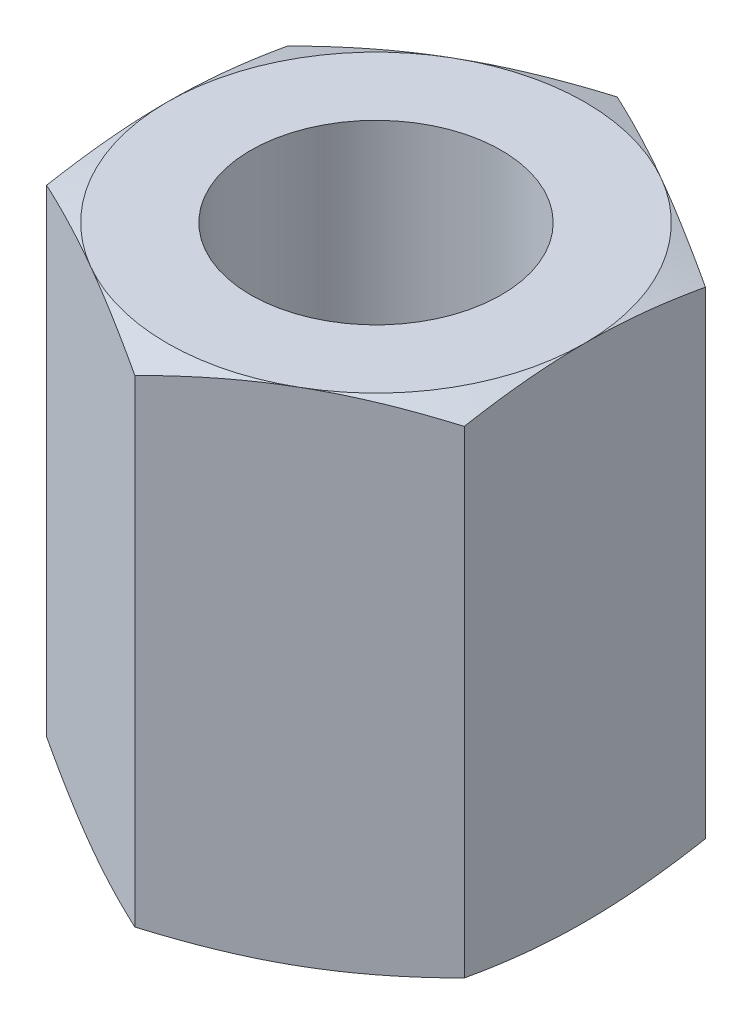
ISO-10303-21;
HEADER;
FILE_DESCRIPTION(('STEP AP214'),'2;1');
FILE_NAME('part.step','',(''),(''),'','','');
FILE_SCHEMA(('AUTOMOTIVE_DESIGN { 1 0 10303 214 1 1 1 1 }'));
ENDSEC;
DATA;
#1=APPLICATION_CONTEXT('core data for automotive mechanical design processes');
#2=APPLICATION_PROTOCOL_DEFINITION('international standard','automotive_design',2000,#1);
#3=PRODUCT_CONTEXT('',#1,'mechanical');
#4=PRODUCT('Part','Part','',(#3));
#5=PRODUCT_RELATED_PRODUCT_CATEGORY('part','',(#4));
#6=PRODUCT_DEFINITION_FORMATION('','',#4);
#7=PRODUCT_DEFINITION_CONTEXT('part definition',#1,'design');
#8=PRODUCT_DEFINITION('design','',#6,#7);
#9=PRODUCT_DEFINITION_SHAPE('','',#8);
#10=(LENGTH_UNIT() NAMED_UNIT(*) SI_UNIT(.MILLI.,.METRE.));
#11=(NAMED_UNIT(*) PLANE_ANGLE_UNIT() SI_UNIT($,.RADIAN.));
#12=(NAMED_UNIT(*) SI_UNIT($,.STERADIAN.) SOLID_ANGLE_UNIT());
#13=UNCERTAINTY_MEASURE_WITH_UNIT(LENGTH_MEASURE(1.E-05),#10,'distance_accuracy_value','');
#14=(GEOMETRIC_REPRESENTATION_CONTEXT(3) GLOBAL_UNCERTAINTY_ASSIGNED_CONTEXT((#13)) GLOBAL_UNIT_ASSIGNED_CONTEXT((#10,
#11,#12)) REPRESENTATION_CONTEXT('',''));
#15=CARTESIAN_POINT('',(0.,0.,0.));
#16=DIRECTION('',(0.,0.,1.));
#17=DIRECTION('',(1.,0.,0.));
#18=AXIS2_PLACEMENT_3D('',#15,#16,#17);
#19=CARTESIAN_POINT('',(0.,6.,0.));
#20=DIRECTION('',(0.,1.,0.));
#21=DIRECTION('',(0.,0.,1.));
#22=AXIS2_PLACEMENT_3D('',#19,#20,#21);
#23=PLANE('',#22);
#24=CARTESIAN_POINT('',(0.,6.,0.));
#25=DIRECTION('',(0.,-1.,0.));
#26=DIRECTION('',(0.,0.,-1.));
#27=AXIS2_PLACEMENT_3D('',#24,#25,#26);
#28=CIRCLE('',#27,2.5);
#29=CARTESIAN_POINT('',(-1.24999999999999,6.,2.1650635094611));
#30=VERTEX_POINT('',#29);
#31=CARTESIAN_POINT('',(-2.5,6.,0.));
#32=VERTEX_POINT('',#31);
#33=EDGE_CURVE('E340',#30,#32,#28,.T.);
#34=ORIENTED_EDGE('',*,*,#33,.F.);
#35=CARTESIAN_POINT('',(1.25000000000002,6.,2.16506350946109));
#36=VERTEX_POINT('',#35);
#37=EDGE_CURVE('E338',#36,#30,#28,.T.);
#38=ORIENTED_EDGE('',*,*,#37,.F.);
#39=CARTESIAN_POINT('',(2.5,6.,0.));
#40=VERTEX_POINT('',#39);
#41=EDGE_CURVE('E336',#40,#36,#28,.T.);
#42=ORIENTED_EDGE('',*,*,#41,.F.);
#43=CARTESIAN_POINT('',(1.24999999999999,6.,-2.16506350946111));
#44=VERTEX_POINT('',#43);
#45=EDGE_CURVE('E243',#44,#40,#28,.T.);
#46=ORIENTED_EDGE('',*,*,#45,.F.);
#47=CARTESIAN_POINT('',(-1.25,6.,-2.1650635094611));
#48=VERTEX_POINT('',#47);
#49=EDGE_CURVE('E339',#48,#44,#28,.T.);
#50=ORIENTED_EDGE('',*,*,#49,.F.);
#51=EDGE_CURVE('E344',#32,#48,#28,.T.);
#52=ORIENTED_EDGE('',*,*,#51,.F.);
#53=EDGE_LOOP('',(#34,#38,#42,#46,#50,#52));
#54=FACE_BOUND('',#53,.T.);
#55=CARTESIAN_POINT('',(0.,6.,0.));
#56=DIRECTION('',(0.,1.,0.));
#57=DIRECTION('',(0.,0.,1.));
#58=AXIS2_PLACEMENT_3D('',#55,#56,#57);
#59=CIRCLE('',#58,1.5);
#60=CARTESIAN_POINT('',(0.,6.,1.5));
#61=VERTEX_POINT('',#60);
#62=EDGE_CURVE('E306',#61,#61,#59,.T.);
#63=ORIENTED_EDGE('',*,*,#62,.F.);
#64=EDGE_LOOP('',(#63));
#65=FACE_BOUND('',#64,.T.);
#66=ADVANCED_FACE('F33',(#54,#65),#23,.T.);
#67=CARTESIAN_POINT('',(0.,0.,0.));
#68=DIRECTION('',(0.,1.,0.));
#69=DIRECTION('',(0.,0.,1.));
#70=AXIS2_PLACEMENT_3D('',#67,#68,#69);
#71=PLANE('',#70);
#72=CARTESIAN_POINT('',(0.,0.,0.));
#73=DIRECTION('',(0.,-1.,0.));
#74=DIRECTION('',(0.,0.,-1.));
#75=AXIS2_PLACEMENT_3D('',#72,#73,#74);
#76=CIRCLE('',#75,2.5);
#77=CARTESIAN_POINT('',(1.25000000000002,0.,2.16506350946109));
#78=VERTEX_POINT('',#77);
#79=CARTESIAN_POINT('',(-1.24999999999999,0.,2.1650635094611));
#80=VERTEX_POINT('',#79);
#81=EDGE_CURVE('E138',#78,#80,#76,.T.);
#82=ORIENTED_EDGE('',*,*,#81,.T.);
#83=CARTESIAN_POINT('',(-2.5,0.,0.));
#84=VERTEX_POINT('',#83);
#85=EDGE_CURVE('E161',#80,#84,#76,.T.);
#86=ORIENTED_EDGE('',*,*,#85,.T.);
#87=CARTESIAN_POINT('',(-1.25,0.,-2.1650635094611));
#88=VERTEX_POINT('',#87);
#89=EDGE_CURVE('E160',#84,#88,#76,.T.);
#90=ORIENTED_EDGE('',*,*,#89,.T.);
#91=CARTESIAN_POINT('',(1.24999999999999,0.,-2.16506350946111));
#92=VERTEX_POINT('',#91);
#93=EDGE_CURVE('E157',#88,#92,#76,.T.);
#94=ORIENTED_EDGE('',*,*,#93,.T.);
#95=CARTESIAN_POINT('',(2.5,0.,0.));
#96=VERTEX_POINT('',#95);
#97=EDGE_CURVE('E55',#92,#96,#76,.T.);
#98=ORIENTED_EDGE('',*,*,#97,.T.);
#99=EDGE_CURVE('E131',#96,#78,#76,.T.);
#100=ORIENTED_EDGE('',*,*,#99,.T.);
#101=EDGE_LOOP('',(#82,#86,#90,#94,#98,#100));
#102=FACE_BOUND('',#101,.T.);
#103=CARTESIAN_POINT('',(0.,0.,0.));
#104=DIRECTION('',(0.,1.,0.));
#105=DIRECTION('',(0.,0.,1.));
#106=AXIS2_PLACEMENT_3D('',#103,#104,#105);
#107=CIRCLE('',#106,1.5);
#108=CARTESIAN_POINT('',(0.,0.,1.5));
#109=VERTEX_POINT('',#108);
#110=EDGE_CURVE('E309',#109,#109,#107,.T.);
#111=ORIENTED_EDGE('',*,*,#110,.T.);
#112=EDGE_LOOP('',(#111));
#113=FACE_BOUND('',#112,.T.);
#114=ADVANCED_FACE('F154',(#102,#113),#71,.F.);
#115=CARTESIAN_POINT('',(2.49999999999998,6.,-1.44337567297409));
#116=DIRECTION('',(-0.499999999999995,0.,0.866025403784441));
#117=DIRECTION('',(0.866025403784442,0.,0.499999999999995));
#118=AXIS2_PLACEMENT_3D('',#115,#116,#117);
#119=PLANE('',#118);
#120=DIRECTION('',(0.,-1.,0.));
#121=VECTOR('',#120,1.);
#122=CARTESIAN_POINT('',(2.49999999999998,6.,-1.44337567297409));
#123=LINE('',#122,#121);
#124=CARTESIAN_POINT('',(2.49999999999999,5.85923402201249,-1.44337567297409));
#125=VERTEX_POINT('',#124);
#126=CARTESIAN_POINT('',(2.49999999999998,0.140765977987506,-1.44337567297409));
#127=VERTEX_POINT('',#126);
#128=EDGE_CURVE('E312',#125,#127,#123,.T.);
#129=ORIENTED_EDGE('',*,*,#128,.T.);
#130=CARTESIAN_POINT('',(2.50019999999998,0.140808008171611,-1.44326020292026));
#131=CARTESIAN_POINT('',(2.39665305132346,0.119039069131315,-1.50304306161241));
#132=CARTESIAN_POINT('',(2.29276461388714,0.0992363286997188,-1.56302307893196));
#133=CARTESIAN_POINT('',(2.08431213823203,0.0643963200817523,-1.68337317186468));
#134=CARTESIAN_POINT('',(1.97974763612162,0.0493627822141135,-1.7437435153058));
#135=CARTESIAN_POINT('',(1.77110364851345,0.025046411161083,-1.86420417771618));
#136=CARTESIAN_POINT('',(1.6670289296066,0.0157105319226291,-1.92429174469288));
#137=CARTESIAN_POINT('',(1.45863606978594,0.00318847973073293,-2.04460741840753));
#138=CARTESIAN_POINT('',(1.35431803489297,0.,-2.10483546393432));
#139=CARTESIAN_POINT('',(1.14568196510702,0.,-2.2252915549879));
#140=CARTESIAN_POINT('',(1.04136393021405,0.00318847973073272,-2.28551960051469));
#141=CARTESIAN_POINT('',(0.832971070393385,0.015710531922629,-2.40583527422935));
#142=CARTESIAN_POINT('',(0.728896351486536,0.025046411161083,-2.46592284120605));
#143=CARTESIAN_POINT('',(0.520252363878367,0.0493627822141135,-2.58638350361642));
#144=CARTESIAN_POINT('',(0.415687861767961,0.0643963200817522,-2.64675384705754));
#145=CARTESIAN_POINT('',(0.207235386112848,0.0992363286997185,-2.76710393999026));
#146=CARTESIAN_POINT('',(0.103346948676527,0.119039069131315,-2.82708395730981));
#147=CARTESIAN_POINT('',(-0.0001999999999993,0.140808008171611,-2.88686681600197));
#148=B_SPLINE_CURVE_WITH_KNOTS('',3,(#130,#131,#132,#133,#134,#135,#136,#137,#138,#139,#140,
#141,#142,#143,#144,#145,#146,#147),.UNSPECIFIED.,.F.,.F.,(4,2,2,2,2,2,2,2,4),(0.,
0.364631406980055,0.729547317866326,1.09101180768958,1.45234063356534,1.8136694594411,
2.17513394926436,2.54004986015063,2.90468126713068),.UNSPECIFIED.);
#149=EDGE_CURVE('E143',#127,#92,#148,.T.);
#150=ORIENTED_EDGE('',*,*,#149,.T.);
#151=CARTESIAN_POINT('',(0.,0.140765977987506,-2.88675134594813));
#152=VERTEX_POINT('',#151);
#153=EDGE_CURVE('E351',#92,#152,#148,.T.);
#154=ORIENTED_EDGE('',*,*,#153,.T.);
#155=DIRECTION('',(0.,-1.,0.));
#156=VECTOR('',#155,1.);
#157=CARTESIAN_POINT('',(0.,6.,-2.88675134594813));
#158=LINE('',#157,#156);
#159=CARTESIAN_POINT('',(0.,5.85923402201249,-2.88675134594813));
#160=VERTEX_POINT('',#159);
#161=EDGE_CURVE('E322',#160,#152,#158,.T.);
#162=ORIENTED_EDGE('',*,*,#161,.F.);
#163=CARTESIAN_POINT('',(-0.000199999999999947,5.85919199182839,-2.88686681600197));
#164=CARTESIAN_POINT('',(0.103346948676526,5.88096093086869,-2.82708395730981));
#165=CARTESIAN_POINT('',(0.207235386112847,5.90076367130028,-2.76710393999026));
#166=CARTESIAN_POINT('',(0.41568786176796,5.93560367991825,-2.64675384705754));
#167=CARTESIAN_POINT('',(0.520252363878367,5.95063721778589,-2.58638350361642));
#168=CARTESIAN_POINT('',(0.728896351486535,5.97495358883892,-2.46592284120605));
#169=CARTESIAN_POINT('',(0.832971070393384,5.98428946807737,-2.40583527422935));
#170=CARTESIAN_POINT('',(1.04136393021405,5.99681152026927,-2.28551960051469));
#171=CARTESIAN_POINT('',(1.14568196510702,6.,-2.2252915549879));
#172=CARTESIAN_POINT('',(1.35431803489297,6.,-2.10483546393432));
#173=CARTESIAN_POINT('',(1.45863606978594,5.99681152026927,-2.04460741840753));
#174=CARTESIAN_POINT('',(1.6670289296066,5.98428946807737,-1.92429174469288));
#175=CARTESIAN_POINT('',(1.77110364851345,5.97495358883892,-1.86420417771618));
#176=CARTESIAN_POINT('',(1.97974763612162,5.95063721778589,-1.7437435153058));
#177=CARTESIAN_POINT('',(2.08431213823203,5.93560367991825,-1.68337317186468));
#178=CARTESIAN_POINT('',(2.29276461388714,5.90076367130028,-1.56302307893196));
#179=CARTESIAN_POINT('',(2.39665305132346,5.88096093086869,-1.50304306161241));
#180=CARTESIAN_POINT('',(2.50019999999998,5.85919199182839,-1.44326020292026));
#181=B_SPLINE_CURVE_WITH_KNOTS('',3,(#163,#164,#165,#166,#167,#168,#169,#170,#171,#172,#173,
#174,#175,#176,#177,#178,#179,#180),.UNSPECIFIED.,.F.,.F.,(4,2,2,2,2,2,2,2,4),(0.,
0.364631406980055,0.729547317866326,1.09101180768958,1.45234063356534,1.8136694594411,
2.17513394926436,2.54004986015063,2.90468126713068),.UNSPECIFIED.);
#182=EDGE_CURVE('E251',#160,#44,#181,.T.);
#183=ORIENTED_EDGE('',*,*,#182,.T.);
#184=EDGE_CURVE('E242',#44,#125,#181,.T.);
#185=ORIENTED_EDGE('',*,*,#184,.T.);
#186=EDGE_LOOP('',(#129,#150,#154,#162,#183,#185));
#187=FACE_BOUND('',#186,.T.);
#188=ADVANCED_FACE('F35',(#187),#119,.F.);
#189=CARTESIAN_POINT('',(0.,6.,-2.88675134594813));
#190=DIRECTION('',(0.500000000000001,0.,0.866025403784438));
#191=DIRECTION('',(0.866025403784438,0.,-0.500000000000001));
#192=AXIS2_PLACEMENT_3D('',#189,#190,#191);
#193=PLANE('',#192);
#194=ORIENTED_EDGE('',*,*,#161,.T.);
#195=CARTESIAN_POINT('',(0.000200000000000051,0.140808008171612,-2.88686681600197));
#196=CARTESIAN_POINT('',(-0.103346948676527,0.119039069131315,-2.82708395730981));
#197=CARTESIAN_POINT('',(-0.207235386112849,0.0992363286997179,-2.76710393999026));
#198=CARTESIAN_POINT('',(-0.415687861767963,0.0643963200817505,-2.64675384705754));
#199=CARTESIAN_POINT('',(-0.520252363878371,0.0493627822141112,-2.58638350361641));
#200=CARTESIAN_POINT('',(-0.728896351486541,0.02504641116108,-2.46592284120604));
#201=CARTESIAN_POINT('',(-0.832971070393391,0.0157105319226258,-2.40583527422933));
#202=CARTESIAN_POINT('',(-1.04136393021405,0.00318847973072924,-2.28551960051468));
#203=CARTESIAN_POINT('',(-1.14568196510703,0.,-2.22529155498789));
#204=CARTESIAN_POINT('',(-1.35431803489298,0.,-2.1048354639343));
#205=CARTESIAN_POINT('',(-1.45863606978595,0.00318847973072923,-2.04460741840751));
#206=CARTESIAN_POINT('',(-1.66702892960661,0.0157105319226257,-1.92429174469286));
#207=CARTESIAN_POINT('',(-1.77110364851346,0.0250464111610799,-1.86420417771615));
#208=CARTESIAN_POINT('',(-1.97974763612163,0.049362782214111,-1.74374351530578));
#209=CARTESIAN_POINT('',(-2.08431213823204,0.0643963200817502,-1.68337317186465));
#210=CARTESIAN_POINT('',(-2.29276461388716,0.0992363286997176,-1.56302307893193));
#211=CARTESIAN_POINT('',(-2.39665305132348,0.119039069131314,-1.50304306161238));
#212=CARTESIAN_POINT('',(-2.5002,0.140808008171611,-1.44326020292022));
#213=B_SPLINE_CURVE_WITH_KNOTS('',3,(#195,#196,#197,#198,#199,#200,#201,#202,#203,#204,#205,
#206,#207,#208,#209,#210,#211,#212),.UNSPECIFIED.,.F.,.F.,(4,2,2,2,2,2,2,2,4),(0.,
0.364631406980059,0.729547317866335,1.0910118076896,1.45234063356536,1.81366945944112,
2.17513394926438,2.54004986015066,2.90468126713072),.UNSPECIFIED.);
#214=EDGE_CURVE('E189',#152,#88,#213,.T.);
#215=ORIENTED_EDGE('',*,*,#214,.T.);
#216=CARTESIAN_POINT('',(-2.5,0.140765977987506,-1.44337567297406));
#217=VERTEX_POINT('',#216);
#218=EDGE_CURVE('E188',#88,#217,#213,.T.);
#219=ORIENTED_EDGE('',*,*,#218,.T.);
#220=DIRECTION('',(0.,-1.,0.));
#221=VECTOR('',#220,1.);
#222=CARTESIAN_POINT('',(-2.5,6.,-1.44337567297406));
#223=LINE('',#222,#221);
#224=CARTESIAN_POINT('',(-2.5,5.85923402201249,-1.44337567297406));
#225=VERTEX_POINT('',#224);
#226=EDGE_CURVE('E184',#225,#217,#223,.T.);
#227=ORIENTED_EDGE('',*,*,#226,.F.);
#228=CARTESIAN_POINT('',(-2.5002,5.85919199182839,-1.44326020292022));
#229=CARTESIAN_POINT('',(-2.39665305132348,5.88096093086869,-1.50304306161238));
#230=CARTESIAN_POINT('',(-2.29276461388716,5.90076367130028,-1.56302307893193));
#231=CARTESIAN_POINT('',(-2.08431213823204,5.93560367991825,-1.68337317186465));
#232=CARTESIAN_POINT('',(-1.97974763612163,5.95063721778589,-1.74374351530578));
#233=CARTESIAN_POINT('',(-1.77110364851346,5.97495358883892,-1.86420417771615));
#234=CARTESIAN_POINT('',(-1.66702892960661,5.98428946807737,-1.92429174469286));
#235=CARTESIAN_POINT('',(-1.45863606978595,5.99681152026927,-2.04460741840751));
#236=CARTESIAN_POINT('',(-1.35431803489298,6.,-2.1048354639343));
#237=CARTESIAN_POINT('',(-1.14568196510703,6.,-2.22529155498789));
#238=CARTESIAN_POINT('',(-1.04136393021405,5.99681152026927,-2.28551960051468));
#239=CARTESIAN_POINT('',(-0.832971070393391,5.98428946807737,-2.40583527422933));
#240=CARTESIAN_POINT('',(-0.728896351486541,5.97495358883892,-2.46592284120604));
#241=CARTESIAN_POINT('',(-0.520252363878371,5.95063721778589,-2.58638350361641));
#242=CARTESIAN_POINT('',(-0.415687861767963,5.93560367991825,-2.64675384705754));
#243=CARTESIAN_POINT('',(-0.207235386112849,5.90076367130028,-2.76710393999026));
#244=CARTESIAN_POINT('',(-0.103346948676527,5.88096093086869,-2.82708395730981));
#245=CARTESIAN_POINT('',(0.000199999999999951,5.85919199182839,-2.88686681600197));
#246=B_SPLINE_CURVE_WITH_KNOTS('',3,(#228,#229,#230,#231,#232,#233,#234,#235,#236,#237,#238,
#239,#240,#241,#242,#243,#244,#245),.UNSPECIFIED.,.F.,.F.,(4,2,2,2,2,2,2,2,4),(0.,
0.364631406980059,0.729547317866335,1.0910118076896,1.45234063356536,1.81366945944112,
2.17513394926439,2.54004986015066,2.90468126713072),.UNSPECIFIED.);
#247=EDGE_CURVE('E267',#225,#48,#246,.T.);
#248=ORIENTED_EDGE('',*,*,#247,.T.);
#249=EDGE_CURVE('E259',#48,#160,#246,.T.);
#250=ORIENTED_EDGE('',*,*,#249,.T.);
#251=EDGE_LOOP('',(#194,#215,#219,#227,#248,#250));
#252=FACE_BOUND('',#251,.T.);
#253=ADVANCED_FACE('F274',(#252),#193,.F.);
#254=CARTESIAN_POINT('',(-2.5,6.,-1.44337567297406));
#255=DIRECTION('',(1.,0.,0.));
#256=DIRECTION('',(0.,0.,-1.));
#257=AXIS2_PLACEMENT_3D('',#254,#255,#256);
#258=PLANE('',#257);
#259=ORIENTED_EDGE('',*,*,#226,.T.);
#260=CARTESIAN_POINT('',(-2.50000000000001,0.911069918498288,-4.33375705030873));
#261=CARTESIAN_POINT('',(-2.50000000000001,0.857151962741812,-4.1626121487893));
#262=CARTESIAN_POINT('',(-2.50000000000001,0.803889247670842,-3.99125292656233));
#263=CARTESIAN_POINT('',(-2.50000000000001,0.699303356408631,-3.6479012296047));
#264=CARTESIAN_POINT('',(-2.50000000000001,0.647980635713844,-3.47590861643411));
#265=CARTESIAN_POINT('',(-2.50000000000001,0.547192255797197,-3.12862476065281));
#266=CARTESIAN_POINT('',(-2.50000000000001,0.497765115102514,-2.95332226186823));
#267=CARTESIAN_POINT('',(-2.50000000000001,0.402640277745618,-2.60170577064684));
#268=CARTESIAN_POINT('',(-2.50000000000001,0.356942439150244,-2.42539181697851));
#269=CARTESIAN_POINT('',(-2.50000000000001,0.272638394402238,-2.079015966178));
#270=CARTESIAN_POINT('',(-2.50000000000001,0.23381285721517,-1.90900813322596));
#271=CARTESIAN_POINT('',(-2.50000000000001,0.162867038370284,-1.56755699875981));
#272=CARTESIAN_POINT('',(-2.5,0.130747206656142,-1.39611360172359));
#273=CARTESIAN_POINT('',(-2.5,0.0758518227791671,-1.05306244520634));
#274=CARTESIAN_POINT('',(-2.5,0.0530056159219204,-0.881466309778314));
#275=CARTESIAN_POINT('',(-2.5,0.0188225697475267,-0.537127667934878));
#276=CARTESIAN_POINT('',(-2.5,0.00748169084072173,-0.364385585324893));
#277=CARTESIAN_POINT('',(-2.5,4.41044611643525E-05,-0.097393884714278));
#278=CARTESIAN_POINT('',(-2.5,-0.000644888189889834,-0.00325681931257186));
#279=CARTESIAN_POINT('',(-2.5,0.00184631107398365,0.184970103743175));
#280=CARTESIAN_POINT('',(-2.5,0.00502655264592363,0.279059960775849));
#281=CARTESIAN_POINT('',(-2.5,0.0151239518844881,0.467060430735583));
#282=CARTESIAN_POINT('',(-2.5,0.0220420903773777,0.560970990121263));
#283=CARTESIAN_POINT('',(-2.5,0.0393313521905035,0.748477331015612));
#284=CARTESIAN_POINT('',(-2.5,0.0497028075871423,0.842073081377101));
#285=CARTESIAN_POINT('',(-2.5,0.0856400575240508,1.12380926395695));
#286=CARTESIAN_POINT('',(-2.5,0.115934676805286,1.31134961033419));
#287=CARTESIAN_POINT('',(-2.49999999999999,0.185757521056653,1.68464568549849));
#288=CARTESIAN_POINT('',(-2.49999999999999,0.225286525445448,1.87040126226529));
#289=CARTESIAN_POINT('',(-2.49999999999999,0.312868160934003,2.2492938430945));
#290=CARTESIAN_POINT('',(-2.49999999999999,0.361239314019709,2.44235614952978));
#291=CARTESIAN_POINT('',(-2.49999999999999,0.462845732200084,2.82717406569172));
#292=CARTESIAN_POINT('',(-2.49999999999999,0.516080908992447,3.01892969907207));
#293=CARTESIAN_POINT('',(-2.49999999999999,0.625017863722866,3.39827826743581));
#294=CARTESIAN_POINT('',(-2.49999999999999,0.680663797121242,3.58588734311866));
#295=CARTESIAN_POINT('',(-2.49999999999999,0.765880720880502,3.86673968266629));
#296=CARTESIAN_POINT('',(-2.49999999999999,0.794573796432836,3.96025127643636));
#297=CARTESIAN_POINT('',(-2.49999999999999,0.852463883475552,4.14711653548762));
#298=CARTESIAN_POINT('',(-2.49999999999999,0.881660885655843,4.24047020365159));
#299=CARTESIAN_POINT('',(-2.49999999999999,0.911069918498289,4.33375705030875));
#300=B_SPLINE_CURVE_WITH_KNOTS('',3,(#260,#261,#262,#263,#264,#265,#266,#267,#268,#269,#270,
#271,#272,#273,#274,#275,#276,#277,#278,#279,#280,#281,#282,#283,#284,#285,#286,#287,#288,#289,
#290,#291,#292,#293,#294,#295,#296,#297,#298,#299),.UNSPECIFIED.,.F.,.F.,(4,2,2,2,2,2,2,2,2,2,2,
2,2,2,2,2,2,2,2,4),(0.,0.538321778022808,1.0767691747435,1.6231524355488,2.16951489189722,
2.69257527905729,3.21567075158284,3.73470243407139,4.25355181828763,4.53589900114565,
4.81824980763166,5.10067473913603,5.38312683691474,5.95267633652756,6.52227392575275,
7.11926798158167,7.71625120163244,8.3032921668782,8.59673518713048,8.89017279178626),.UNSPECIFIED.);
#301=EDGE_CURVE('E178',#217,#84,#300,.T.);
#302=ORIENTED_EDGE('',*,*,#301,.T.);
#303=CARTESIAN_POINT('',(-2.49999999999999,0.140765977987506,1.44337567297408));
#304=VERTEX_POINT('',#303);
#305=EDGE_CURVE('E174',#84,#304,#300,.T.);
#306=ORIENTED_EDGE('',*,*,#305,.T.);
#307=DIRECTION('',(0.,-1.,0.));
#308=VECTOR('',#307,1.);
#309=CARTESIAN_POINT('',(-2.5,6.,1.44337567297408));
#310=LINE('',#309,#308);
#311=CARTESIAN_POINT('',(-2.49999999999999,5.85923402201249,1.44337567297408));
#312=VERTEX_POINT('',#311);
#313=EDGE_CURVE('E319',#312,#304,#310,.T.);
#314=ORIENTED_EDGE('',*,*,#313,.F.);
#315=CARTESIAN_POINT('',(-2.49999999999999,5.08893008150171,4.33375705030875));
#316=CARTESIAN_POINT('',(-2.49999999999999,5.14284803725819,4.16261214878932));
#317=CARTESIAN_POINT('',(-2.49999999999999,5.19611075232916,3.99125292656235));
#318=CARTESIAN_POINT('',(-2.49999999999999,5.30069664359137,3.64790122960472));
#319=CARTESIAN_POINT('',(-2.49999999999999,5.35201936428616,3.47590861643412));
#320=CARTESIAN_POINT('',(-2.49999999999999,5.4528077442028,3.12862476065282));
#321=CARTESIAN_POINT('',(-2.49999999999999,5.50223488489749,2.95332226186824));
#322=CARTESIAN_POINT('',(-2.49999999999999,5.59735972225438,2.60170577064686));
#323=CARTESIAN_POINT('',(-2.49999999999999,5.64305756084976,2.42539181697853));
#324=CARTESIAN_POINT('',(-2.49999999999999,5.72736160559776,2.07901596617802));
#325=CARTESIAN_POINT('',(-2.49999999999999,5.76618714278483,1.90900813322597));
#326=CARTESIAN_POINT('',(-2.49999999999999,5.83713296162972,1.56755699875983));
#327=CARTESIAN_POINT('',(-2.5,5.86925279334386,1.39611360172361));
#328=CARTESIAN_POINT('',(-2.5,5.92414817722083,1.05306244520636));
#329=CARTESIAN_POINT('',(-2.5,5.94699438407808,0.88146630977833));
#330=CARTESIAN_POINT('',(-2.5,5.98117743025247,0.537127667934894));
#331=CARTESIAN_POINT('',(-2.5,5.99251830915928,0.364385585324909));
#332=CARTESIAN_POINT('',(-2.5,5.99995589553884,0.0973938847142936));
#333=CARTESIAN_POINT('',(-2.5,6.00064488818989,0.00325681931258734));
#334=CARTESIAN_POINT('',(-2.5,5.99815368892602,-0.18497010374316));
#335=CARTESIAN_POINT('',(-2.5,5.99497344735408,-0.279059960775834));
#336=CARTESIAN_POINT('',(-2.5,5.98487604811551,-0.467060430735568));
#337=CARTESIAN_POINT('',(-2.5,5.97795790962262,-0.560970990121248));
#338=CARTESIAN_POINT('',(-2.5,5.9606686478095,-0.748477331015597));
#339=CARTESIAN_POINT('',(-2.5,5.95029719241286,-0.842073081377085));
#340=CARTESIAN_POINT('',(-2.5,5.91435994247595,-1.12380926395693));
#341=CARTESIAN_POINT('',(-2.5,5.88406532319471,-1.31134961033417));
#342=CARTESIAN_POINT('',(-2.50000000000001,5.81424247894335,-1.68464568549847));
#343=CARTESIAN_POINT('',(-2.50000000000001,5.77471347455455,-1.87040126226527));
#344=CARTESIAN_POINT('',(-2.50000000000001,5.687131839066,-2.24929384309449));
#345=CARTESIAN_POINT('',(-2.50000000000001,5.63876068598029,-2.44235614952976));
#346=CARTESIAN_POINT('',(-2.50000000000001,5.53715426779992,-2.8271740656917));
#347=CARTESIAN_POINT('',(-2.50000000000001,5.48391909100755,-3.01892969907205));
#348=CARTESIAN_POINT('',(-2.50000000000001,5.37498213627713,-3.39827826743579));
#349=CARTESIAN_POINT('',(-2.50000000000001,5.31933620287876,-3.58588734311864));
#350=CARTESIAN_POINT('',(-2.50000000000001,5.2341192791195,-3.86673968266627));
#351=CARTESIAN_POINT('',(-2.50000000000001,5.20542620356716,-3.96025127643634));
#352=CARTESIAN_POINT('',(-2.50000000000001,5.14753611652445,-4.14711653548761));
#353=CARTESIAN_POINT('',(-2.50000000000001,5.11833911434416,-4.24047020365157));
#354=CARTESIAN_POINT('',(-2.50000000000001,5.08893008150171,-4.33375705030873));
#355=B_SPLINE_CURVE_WITH_KNOTS('',3,(#315,#316,#317,#318,#319,#320,#321,#322,#323,#324,#325,
#326,#327,#328,#329,#330,#331,#332,#333,#334,#335,#336,#337,#338,#339,#340,#341,#342,#343,#344,
#345,#346,#347,#348,#349,#350,#351,#352,#353,#354),.UNSPECIFIED.,.F.,.F.,(4,2,2,2,2,2,2,2,2,2,2,
2,2,2,2,2,2,2,2,4),(0.,0.538321778022808,1.07676917474351,1.6231524355488,2.16951489189722,
2.69257527905729,3.21567075158284,3.73470243407139,4.25355181828763,4.53589900114565,
4.81824980763166,5.10067473913603,5.38312683691474,5.95267633652756,6.52227392575275,
7.11926798158167,7.71625120163244,8.3032921668782,8.59673518713048,8.89017279178626),.UNSPECIFIED.);
#356=EDGE_CURVE('E310',#312,#32,#355,.T.);
#357=ORIENTED_EDGE('',*,*,#356,.T.);
#358=EDGE_CURVE('E268',#32,#225,#355,.T.);
#359=ORIENTED_EDGE('',*,*,#358,.T.);
#360=EDGE_LOOP('',(#259,#302,#306,#314,#357,#359));
#361=FACE_BOUND('',#360,.T.);
#362=ADVANCED_FACE('F181',(#361),#258,.F.);
#363=CARTESIAN_POINT('',(-2.5,6.,1.44337567297408));
#364=DIRECTION('',(0.499999999999995,0.,-0.866025403784442));
#365=DIRECTION('',(-0.866025403784442,0.,-0.499999999999995));
#366=AXIS2_PLACEMENT_3D('',#363,#364,#365);
#367=PLANE('',#366);
#368=ORIENTED_EDGE('',*,*,#313,.T.);
#369=CARTESIAN_POINT('',(-2.5002,0.140808008171612,1.44326020292024));
#370=CARTESIAN_POINT('',(-2.39665305132347,0.119039069131314,1.5030430616124));
#371=CARTESIAN_POINT('',(-2.29276461388715,0.0992363286997177,1.56302307893195));
#372=CARTESIAN_POINT('',(-2.08431213823203,0.0643963200817504,1.68337317186467));
#373=CARTESIAN_POINT('',(-1.97974763612162,0.0493627822141112,1.74374351530579));
#374=CARTESIAN_POINT('',(-1.77110364851345,0.02504641116108,1.86420417771616));
#375=CARTESIAN_POINT('',(-1.6670289296066,0.0157105319226258,1.92429174469287));
#376=CARTESIAN_POINT('',(-1.45863606978594,0.00318847973072916,2.04460741840752));
#377=CARTESIAN_POINT('',(-1.35431803489296,0.,2.10483546393431));
#378=CARTESIAN_POINT('',(-1.14568196510701,0.,2.22529155498789));
#379=CARTESIAN_POINT('',(-1.04136393021404,0.00318847973072908,2.28551960051469));
#380=CARTESIAN_POINT('',(-0.832971070393375,0.0157105319226256,2.40583527422934));
#381=CARTESIAN_POINT('',(-0.728896351486524,0.0250464111610798,2.46592284120604));
#382=CARTESIAN_POINT('',(-0.520252363878353,0.049362782214111,2.58638350361642));
#383=CARTESIAN_POINT('',(-0.415687861767945,0.0643963200817502,2.64675384705754));
#384=CARTESIAN_POINT('',(-0.20723538611283,0.0992363286997175,2.76710393999026));
#385=CARTESIAN_POINT('',(-0.103346948676508,0.119039069131314,2.82708395730981));
#386=CARTESIAN_POINT('',(0.000200000000019801,0.140808008171611,2.88686681600197));
#387=B_SPLINE_CURVE_WITH_KNOTS('',3,(#369,#370,#371,#372,#373,#374,#375,#376,#377,#378,#379,
#380,#381,#382,#383,#384,#385,#386),.UNSPECIFIED.,.F.,.F.,(4,2,2,2,2,2,2,2,4),(0.,
0.36463140698006,0.729547317866335,1.0910118076896,1.45234063356536,1.81366945944112,
2.17513394926439,2.54004986015066,2.90468126713072),.UNSPECIFIED.);
#388=EDGE_CURVE('E63',#304,#80,#387,.T.);
#389=ORIENTED_EDGE('',*,*,#388,.T.);
#390=CARTESIAN_POINT('',(0.,0.140765977987506,2.88675134594813));
#391=VERTEX_POINT('',#390);
#392=EDGE_CURVE('E166',#80,#391,#387,.T.);
#393=ORIENTED_EDGE('',*,*,#392,.T.);
#394=DIRECTION('',(0.,-1.,0.));
#395=VECTOR('',#394,1.);
#396=CARTESIAN_POINT('',(0.,6.,2.88675134594813));
#397=LINE('',#396,#395);
#398=CARTESIAN_POINT('',(0.,5.85923402201249,2.88675134594813));
#399=VERTEX_POINT('',#398);
#400=EDGE_CURVE('E317',#399,#391,#397,.T.);
#401=ORIENTED_EDGE('',*,*,#400,.F.);
#402=CARTESIAN_POINT('',(0.000200000000020158,5.85919199182839,2.88686681600197));
#403=CARTESIAN_POINT('',(-0.103346948676508,5.88096093086869,2.82708395730981));
#404=CARTESIAN_POINT('',(-0.20723538611283,5.90076367130028,2.76710393999026));
#405=CARTESIAN_POINT('',(-0.415687861767945,5.93560367991825,2.64675384705754));
#406=CARTESIAN_POINT('',(-0.520252363878353,5.95063721778589,2.58638350361642));
#407=CARTESIAN_POINT('',(-0.728896351486524,5.97495358883892,2.46592284120604));
#408=CARTESIAN_POINT('',(-0.832971070393375,5.98428946807737,2.40583527422934));
#409=CARTESIAN_POINT('',(-1.04136393021404,5.99681152026927,2.28551960051469));
#410=CARTESIAN_POINT('',(-1.14568196510701,6.,2.22529155498789));
#411=CARTESIAN_POINT('',(-1.35431803489296,6.,2.10483546393431));
#412=CARTESIAN_POINT('',(-1.45863606978594,5.99681152026927,2.04460741840752));
#413=CARTESIAN_POINT('',(-1.6670289296066,5.98428946807737,1.92429174469287));
#414=CARTESIAN_POINT('',(-1.77110364851345,5.97495358883892,1.86420417771616));
#415=CARTESIAN_POINT('',(-1.97974763612162,5.95063721778589,1.74374351530579));
#416=CARTESIAN_POINT('',(-2.08431213823203,5.93560367991825,1.68337317186467));
#417=CARTESIAN_POINT('',(-2.29276461388715,5.90076367130028,1.56302307893195));
#418=CARTESIAN_POINT('',(-2.39665305132347,5.88096093086869,1.5030430616124));
#419=CARTESIAN_POINT('',(-2.5002,5.85919199182839,1.44326020292024));
#420=B_SPLINE_CURVE_WITH_KNOTS('',3,(#402,#403,#404,#405,#406,#407,#408,#409,#410,#411,#412,
#413,#414,#415,#416,#417,#418,#419),.UNSPECIFIED.,.F.,.F.,(4,2,2,2,2,2,2,2,4),(0.,
0.36463140698006,0.729547317866335,1.0910118076896,1.45234063356536,1.81366945944112,
2.17513394926439,2.54004986015066,2.90468126713072),.UNSPECIFIED.);
#421=EDGE_CURVE('E252',#399,#30,#420,.T.);
#422=ORIENTED_EDGE('',*,*,#421,.T.);
#423=EDGE_CURVE('E260',#30,#312,#420,.T.);
#424=ORIENTED_EDGE('',*,*,#423,.T.);
#425=EDGE_LOOP('',(#368,#389,#393,#401,#422,#424));
#426=FACE_BOUND('',#425,.T.);
#427=ADVANCED_FACE('F228',(#426),#367,.F.);
#428=CARTESIAN_POINT('',(0.,6.,2.88675134594813));
#429=DIRECTION('',(-0.500000000000007,0.,-0.866025403784435));
#430=DIRECTION('',(-0.866025403784435,0.,0.500000000000007));
#431=AXIS2_PLACEMENT_3D('',#428,#429,#430);
#432=PLANE('',#431);
#433=ORIENTED_EDGE('',*,*,#400,.T.);
#434=CARTESIAN_POINT('',(-0.000199999999979897,0.140808008171611,2.88686681600197));
#435=CARTESIAN_POINT('',(0.103346948676547,0.119039069131314,2.82708395730981));
#436=CARTESIAN_POINT('',(0.207235386112869,0.0992363286997175,2.76710393999026));
#437=CARTESIAN_POINT('',(0.415687861767982,0.0643963200817502,2.64675384705753));
#438=CARTESIAN_POINT('',(0.520252363878389,0.049362782214111,2.58638350361641));
#439=CARTESIAN_POINT('',(0.728896351486559,0.0250464111610799,2.46592284120603));
#440=CARTESIAN_POINT('',(0.832971070393408,0.0157105319226257,2.40583527422933));
#441=CARTESIAN_POINT('',(1.04136393021407,0.00318847973072912,2.28551960051467));
#442=CARTESIAN_POINT('',(1.14568196510704,0.,2.22529155498788));
#443=CARTESIAN_POINT('',(1.35431803489299,0.,2.10483546393429));
#444=CARTESIAN_POINT('',(1.45863606978597,0.00318847973072921,2.0446074184075));
#445=CARTESIAN_POINT('',(1.66702892960663,0.0157105319226258,1.92429174469284));
#446=CARTESIAN_POINT('',(1.77110364851348,0.02504641116108,1.86420417771614));
#447=CARTESIAN_POINT('',(1.97974763612165,0.0493627822141112,1.74374351530576));
#448=CARTESIAN_POINT('',(2.08431213823205,0.0643963200817505,1.68337317186464));
#449=CARTESIAN_POINT('',(2.29276461388717,0.0992363286997179,1.56302307893191));
#450=CARTESIAN_POINT('',(2.39665305132349,0.119039069131315,1.50304306161236));
#451=CARTESIAN_POINT('',(2.50020000000002,0.140808008171612,1.4432602029202));
#452=B_SPLINE_CURVE_WITH_KNOTS('',3,(#434,#435,#436,#437,#438,#439,#440,#441,#442,#443,#444,
#445,#446,#447,#448,#449,#450,#451),.UNSPECIFIED.,.F.,.F.,(4,2,2,2,2,2,2,2,4),(0.,
0.36463140698006,0.729547317866335,1.0910118076896,1.45234063356536,1.81366945944112,
2.17513394926439,2.54004986015066,2.90468126713072),.UNSPECIFIED.);
#453=EDGE_CURVE('E158',#391,#78,#452,.T.);
#454=ORIENTED_EDGE('',*,*,#453,.T.);
#455=CARTESIAN_POINT('',(2.50000000000002,0.140765977987506,1.44337567297404));
#456=VERTEX_POINT('',#455);
#457=EDGE_CURVE('E134',#78,#456,#452,.T.);
#458=ORIENTED_EDGE('',*,*,#457,.T.);
#459=DIRECTION('',(0.,-1.,0.));
#460=VECTOR('',#459,1.);
#461=CARTESIAN_POINT('',(2.50000000000002,6.,1.44337567297404));
#462=LINE('',#461,#460);
#463=CARTESIAN_POINT('',(2.50000000000002,5.85923402201249,1.44337567297404));
#464=VERTEX_POINT('',#463);
#465=EDGE_CURVE('E152',#464,#456,#462,.T.);
#466=ORIENTED_EDGE('',*,*,#465,.F.);
#467=CARTESIAN_POINT('',(2.50020000000002,5.85919199182839,1.4432602029202));
#468=CARTESIAN_POINT('',(2.39665305132349,5.88096093086869,1.50304306161236));
#469=CARTESIAN_POINT('',(2.29276461388717,5.90076367130028,1.56302307893191));
#470=CARTESIAN_POINT('',(2.08431213823205,5.93560367991825,1.68337317186464));
#471=CARTESIAN_POINT('',(1.97974763612165,5.95063721778589,1.74374351530576));
#472=CARTESIAN_POINT('',(1.77110364851348,5.97495358883892,1.86420417771614));
#473=CARTESIAN_POINT('',(1.66702892960663,5.98428946807737,1.92429174469284));
#474=CARTESIAN_POINT('',(1.45863606978597,5.99681152026927,2.0446074184075));
#475=CARTESIAN_POINT('',(1.35431803489299,6.,2.10483546393429));
#476=CARTESIAN_POINT('',(1.14568196510704,6.,2.22529155498788));
#477=CARTESIAN_POINT('',(1.04136393021407,5.99681152026927,2.28551960051467));
#478=CARTESIAN_POINT('',(0.832971070393408,5.98428946807737,2.40583527422933));
#479=CARTESIAN_POINT('',(0.728896351486559,5.97495358883892,2.46592284120603));
#480=CARTESIAN_POINT('',(0.520252363878389,5.95063721778589,2.58638350361641));
#481=CARTESIAN_POINT('',(0.415687861767982,5.93560367991825,2.64675384705753));
#482=CARTESIAN_POINT('',(0.207235386112869,5.90076367130028,2.76710393999026));
#483=CARTESIAN_POINT('',(0.103346948676547,5.88096093086869,2.82708395730981));
#484=CARTESIAN_POINT('',(-0.000199999999979689,5.85919199182839,2.88686681600197));
#485=B_SPLINE_CURVE_WITH_KNOTS('',3,(#467,#468,#469,#470,#471,#472,#473,#474,#475,#476,#477,
#478,#479,#480,#481,#482,#483,#484),.UNSPECIFIED.,.F.,.F.,(4,2,2,2,2,2,2,2,4),(0.,
0.36463140698006,0.729547317866335,1.0910118076896,1.45234063356536,1.81366945944112,
2.17513394926439,2.54004986015066,2.90468126713072),.UNSPECIFIED.);
#486=EDGE_CURVE('E235',#464,#36,#485,.T.);
#487=ORIENTED_EDGE('',*,*,#486,.T.);
#488=EDGE_CURVE('E244',#36,#399,#485,.T.);
#489=ORIENTED_EDGE('',*,*,#488,.T.);
#490=EDGE_LOOP('',(#433,#454,#458,#466,#487,#489));
#491=FACE_BOUND('',#490,.T.);
#492=ADVANCED_FACE('F225',(#491),#432,.F.);
#493=CARTESIAN_POINT('',(2.50000000000002,6.,1.44337567297404));
#494=DIRECTION('',(-1.,0.,0.));
#495=DIRECTION('',(0.,0.,1.));
#496=AXIS2_PLACEMENT_3D('',#493,#494,#495);
#497=PLANE('',#496);
#498=ORIENTED_EDGE('',*,*,#465,.T.);
#499=CARTESIAN_POINT('',(2.50000000000005,0.911069918498289,4.33375705030872));
#500=CARTESIAN_POINT('',(2.50000000000004,0.857151962741812,4.16261214878928));
#501=CARTESIAN_POINT('',(2.50000000000004,0.803889247670842,3.99125292656231));
#502=CARTESIAN_POINT('',(2.50000000000004,0.699303356408631,3.64790122960468));
#503=CARTESIAN_POINT('',(2.50000000000004,0.647980635713845,3.47590861643409));
#504=CARTESIAN_POINT('',(2.50000000000003,0.547192255797197,3.12862476065279));
#505=CARTESIAN_POINT('',(2.50000000000003,0.497765115102514,2.95332226186821));
#506=CARTESIAN_POINT('',(2.50000000000003,0.402640277745618,2.60170577064683));
#507=CARTESIAN_POINT('',(2.50000000000003,0.356942439150244,2.4253918169785));
#508=CARTESIAN_POINT('',(2.50000000000002,0.272638394402238,2.07901596617798));
#509=CARTESIAN_POINT('',(2.50000000000002,0.23381285721517,1.90900813322594));
#510=CARTESIAN_POINT('',(2.50000000000002,0.162867038370284,1.5675569987598));
#511=CARTESIAN_POINT('',(2.50000000000001,0.130747206656142,1.39611360172357));
#512=CARTESIAN_POINT('',(2.50000000000001,0.0758518227791669,1.05306244520633));
#513=CARTESIAN_POINT('',(2.50000000000001,0.0530056159219203,0.881466309778296));
#514=CARTESIAN_POINT('',(2.50000000000001,0.0188225697475267,0.53712766793486));
#515=CARTESIAN_POINT('',(2.5,0.00748169084072184,0.364385585324875));
#516=CARTESIAN_POINT('',(2.5,4.41044611643389E-05,0.0973938847142599));
#517=CARTESIAN_POINT('',(2.5,-0.000644888189889944,0.00325681931255362));
#518=CARTESIAN_POINT('',(2.5,0.0018463110739836,-0.184970103743194));
#519=CARTESIAN_POINT('',(2.5,0.00502655264592374,-0.279059960775868));
#520=CARTESIAN_POINT('',(2.5,0.0151239518844883,-0.467060430735602));
#521=CARTESIAN_POINT('',(2.49999999999999,0.0220420903773777,-0.560970990121282));
#522=CARTESIAN_POINT('',(2.49999999999999,0.0393313521905034,-0.748477331015631));
#523=CARTESIAN_POINT('',(2.49999999999999,0.0497028075871424,-0.842073081377119));
#524=CARTESIAN_POINT('',(2.49999999999999,0.0856400575240509,-1.12380926395696));
#525=CARTESIAN_POINT('',(2.49999999999999,0.115934676805285,-1.31134961033421));
#526=CARTESIAN_POINT('',(2.49999999999998,0.185757521056653,-1.68464568549851));
#527=CARTESIAN_POINT('',(2.49999999999998,0.225286525445448,-1.87040126226531));
#528=CARTESIAN_POINT('',(2.49999999999998,0.312868160934003,-2.24929384309452));
#529=CARTESIAN_POINT('',(2.49999999999997,0.361239314019709,-2.44235614952979));
#530=CARTESIAN_POINT('',(2.49999999999997,0.462845732200084,-2.82717406569174));
#531=CARTESIAN_POINT('',(2.49999999999997,0.516080908992447,-3.01892969907209));
#532=CARTESIAN_POINT('',(2.49999999999996,0.625017863722867,-3.39827826743583));
#533=CARTESIAN_POINT('',(2.49999999999996,0.680663797121243,-3.58588734311868));
#534=CARTESIAN_POINT('',(2.49999999999996,0.765880720880503,-3.86673968266631));
#535=CARTESIAN_POINT('',(2.49999999999996,0.794573796432836,-3.96025127643638));
#536=CARTESIAN_POINT('',(2.49999999999996,0.852463883475552,-4.14711653548764));
#537=CARTESIAN_POINT('',(2.49999999999996,0.881660885655843,-4.24047020365161));
#538=CARTESIAN_POINT('',(2.49999999999995,0.911069918498289,-4.33375705030877));
#539=B_SPLINE_CURVE_WITH_KNOTS('',3,(#499,#500,#501,#502,#503,#504,#505,#506,#507,#508,#509,
#510,#511,#512,#513,#514,#515,#516,#517,#518,#519,#520,#521,#522,#523,#524,#525,#526,#527,#528,
#529,#530,#531,#532,#533,#534,#535,#536,#537,#538),.UNSPECIFIED.,.F.,.F.,(4,2,2,2,2,2,2,2,2,2,2,
2,2,2,2,2,2,2,2,4),(0.,0.538321778022808,1.0767691747435,1.6231524355488,2.16951489189722,
2.69257527905729,3.21567075158284,3.73470243407139,4.25355181828763,4.53589900114565,
4.81824980763166,5.10067473913603,5.38312683691474,5.95267633652756,6.52227392575275,
7.11926798158167,7.71625120163244,8.30329216687821,8.59673518713048,8.89017279178626),.UNSPECIFIED.);
#540=EDGE_CURVE('E11',#456,#96,#539,.T.);
#541=ORIENTED_EDGE('',*,*,#540,.T.);
#542=EDGE_CURVE('E38',#96,#127,#539,.T.);
#543=ORIENTED_EDGE('',*,*,#542,.T.);
#544=ORIENTED_EDGE('',*,*,#128,.F.);
#545=CARTESIAN_POINT('',(2.49999999999995,5.08893008150171,-4.33375705030877));
#546=CARTESIAN_POINT('',(2.49999999999996,5.14284803725819,-4.16261214878934));
#547=CARTESIAN_POINT('',(2.49999999999996,5.19611075232916,-3.99125292656237));
#548=CARTESIAN_POINT('',(2.49999999999996,5.30069664359137,-3.64790122960473));
#549=CARTESIAN_POINT('',(2.49999999999996,5.35201936428616,-3.47590861643414));
#550=CARTESIAN_POINT('',(2.49999999999997,5.4528077442028,-3.12862476065284));
#551=CARTESIAN_POINT('',(2.49999999999997,5.50223488489749,-2.95332226186826));
#552=CARTESIAN_POINT('',(2.49999999999997,5.59735972225438,-2.60170577064688));
#553=CARTESIAN_POINT('',(2.49999999999997,5.64305756084976,-2.42539181697855));
#554=CARTESIAN_POINT('',(2.49999999999998,5.72736160559776,-2.07901596617804));
#555=CARTESIAN_POINT('',(2.49999999999998,5.76618714278483,-1.90900813322599));
#556=CARTESIAN_POINT('',(2.49999999999998,5.83713296162972,-1.56755699875985));
#557=CARTESIAN_POINT('',(2.49999999999999,5.86925279334386,-1.39611360172362));
#558=CARTESIAN_POINT('',(2.49999999999999,5.92414817722083,-1.05306244520638));
#559=CARTESIAN_POINT('',(2.49999999999999,5.94699438407808,-0.881466309778348));
#560=CARTESIAN_POINT('',(2.49999999999999,5.98117743025247,-0.537127667934912));
#561=CARTESIAN_POINT('',(2.5,5.99251830915928,-0.364385585324927));
#562=CARTESIAN_POINT('',(2.5,5.99995589553884,-0.0973938847143119));
#563=CARTESIAN_POINT('',(2.5,6.00064488818989,-0.00325681931260582));
#564=CARTESIAN_POINT('',(2.5,5.99815368892602,0.184970103743141));
#565=CARTESIAN_POINT('',(2.5,5.99497344735408,0.279059960775815));
#566=CARTESIAN_POINT('',(2.5,5.98487604811551,0.467060430735549));
#567=CARTESIAN_POINT('',(2.50000000000001,5.97795790962262,0.560970990121229));
#568=CARTESIAN_POINT('',(2.50000000000001,5.9606686478095,0.748477331015579));
#569=CARTESIAN_POINT('',(2.50000000000001,5.95029719241286,0.842073081377067));
#570=CARTESIAN_POINT('',(2.50000000000001,5.91435994247595,1.12380926395691));
#571=CARTESIAN_POINT('',(2.50000000000001,5.88406532319471,1.31134961033415));
#572=CARTESIAN_POINT('',(2.50000000000002,5.81424247894335,1.68464568549845));
#573=CARTESIAN_POINT('',(2.50000000000002,5.77471347455455,1.87040126226526));
#574=CARTESIAN_POINT('',(2.50000000000002,5.687131839066,2.24929384309447));
#575=CARTESIAN_POINT('',(2.50000000000003,5.63876068598029,2.44235614952974));
#576=CARTESIAN_POINT('',(2.50000000000003,5.53715426779992,2.82717406569168));
#577=CARTESIAN_POINT('',(2.50000000000003,5.48391909100755,3.01892969907203));
#578=CARTESIAN_POINT('',(2.50000000000004,5.37498213627713,3.39827826743578));
#579=CARTESIAN_POINT('',(2.50000000000004,5.31933620287876,3.58588734311862));
#580=CARTESIAN_POINT('',(2.50000000000004,5.2341192791195,3.86673968266625));
#581=CARTESIAN_POINT('',(2.50000000000004,5.20542620356717,3.96025127643633));
#582=CARTESIAN_POINT('',(2.50000000000004,5.14753611652445,4.14711653548759));
#583=CARTESIAN_POINT('',(2.50000000000004,5.11833911434416,4.24047020365156));
#584=CARTESIAN_POINT('',(2.50000000000005,5.08893008150171,4.33375705030872));
#585=B_SPLINE_CURVE_WITH_KNOTS('',3,(#545,#546,#547,#548,#549,#550,#551,#552,#553,#554,#555,
#556,#557,#558,#559,#560,#561,#562,#563,#564,#565,#566,#567,#568,#569,#570,#571,#572,#573,#574,
#575,#576,#577,#578,#579,#580,#581,#582,#583,#584),.UNSPECIFIED.,.F.,.F.,(4,2,2,2,2,2,2,2,2,2,2,
2,2,2,2,2,2,2,2,4),(0.,0.538321778022808,1.07676917474351,1.6231524355488,2.16951489189722,
2.69257527905729,3.21567075158284,3.73470243407139,4.25355181828763,4.53589900114565,
4.81824980763166,5.10067473913603,5.38312683691474,5.95267633652756,6.52227392575275,
7.11926798158167,7.71625120163244,8.3032921668782,8.59673518713048,8.89017279178626),.UNSPECIFIED.);
#586=EDGE_CURVE('E147',#125,#40,#585,.T.);
#587=ORIENTED_EDGE('',*,*,#586,.T.);
#588=EDGE_CURVE('E323',#40,#464,#585,.T.);
#589=ORIENTED_EDGE('',*,*,#588,.T.);
#590=EDGE_LOOP('',(#498,#541,#543,#544,#587,#589));
#591=FACE_BOUND('',#590,.T.);
#592=ADVANCED_FACE('F149',(#591),#497,.F.);
#593=CARTESIAN_POINT('',(0.,6.,0.));
#594=DIRECTION('',(0.,-1.,0.));
#595=DIRECTION('',(0.,0.,-1.));
#596=AXIS2_PLACEMENT_3D('',#593,#594,#595);
#597=CYLINDRICAL_SURFACE('',#596,1.5);
#598=ORIENTED_EDGE('',*,*,#62,.T.);
#599=EDGE_LOOP('',(#598));
#600=FACE_BOUND('',#599,.T.);
#601=ORIENTED_EDGE('',*,*,#110,.F.);
#602=EDGE_LOOP('',(#601));
#603=FACE_BOUND('',#602,.T.);
#604=ADVANCED_FACE('F293',(#600,#603),#597,.F.);
#605=CARTESIAN_POINT('',(0.,6.,0.));
#606=DIRECTION('',(0.,-1.,0.));
#607=DIRECTION('',(0.,0.,-1.));
#608=AXIS2_PLACEMENT_3D('',#605,#606,#607);
#609=CONICAL_SURFACE('',#608,2.5,1.22173047639604);
#610=ORIENTED_EDGE('',*,*,#588,.F.);
#611=ORIENTED_EDGE('',*,*,#41,.T.);
#612=ORIENTED_EDGE('',*,*,#486,.F.);
#613=EDGE_LOOP('',(#610,#611,#612));
#614=FACE_BOUND('',#613,.T.);
#615=ADVANCED_FACE('F295',(#614),#609,.T.);
#616=ORIENTED_EDGE('',*,*,#45,.T.);
#617=ORIENTED_EDGE('',*,*,#586,.F.);
#618=ORIENTED_EDGE('',*,*,#184,.F.);
#619=EDGE_LOOP('',(#616,#617,#618));
#620=FACE_BOUND('',#619,.T.);
#621=ADVANCED_FACE('F301',(#620),#609,.T.);
#622=ORIENTED_EDGE('',*,*,#488,.F.);
#623=ORIENTED_EDGE('',*,*,#37,.T.);
#624=ORIENTED_EDGE('',*,*,#421,.F.);
#625=EDGE_LOOP('',(#622,#623,#624));
#626=FACE_BOUND('',#625,.T.);
#627=ADVANCED_FACE('F386',(#626),#609,.T.);
#628=ORIENTED_EDGE('',*,*,#423,.F.);
#629=ORIENTED_EDGE('',*,*,#33,.T.);
#630=ORIENTED_EDGE('',*,*,#356,.F.);
#631=EDGE_LOOP('',(#628,#629,#630));
#632=FACE_BOUND('',#631,.T.);
#633=ADVANCED_FACE('F212',(#632),#609,.T.);
#634=ORIENTED_EDGE('',*,*,#51,.T.);
#635=ORIENTED_EDGE('',*,*,#247,.F.);
#636=ORIENTED_EDGE('',*,*,#358,.F.);
#637=EDGE_LOOP('',(#634,#635,#636));
#638=FACE_BOUND('',#637,.T.);
#639=ADVANCED_FACE('F385',(#638),#609,.T.);
#640=ORIENTED_EDGE('',*,*,#49,.T.);
#641=ORIENTED_EDGE('',*,*,#182,.F.);
#642=ORIENTED_EDGE('',*,*,#249,.F.);
#643=EDGE_LOOP('',(#640,#641,#642));
#644=FACE_BOUND('',#643,.T.);
#645=ADVANCED_FACE('F210',(#644),#609,.T.);
#646=CARTESIAN_POINT('',(0.,0.,0.));
#647=DIRECTION('',(0.,1.,0.));
#648=DIRECTION('',(0.,0.,-1.));
#649=AXIS2_PLACEMENT_3D('',#646,#647,#648);
#650=CONICAL_SURFACE('',#649,2.5,1.22173047639604);
#651=ORIENTED_EDGE('',*,*,#542,.F.);
#652=ORIENTED_EDGE('',*,*,#97,.F.);
#653=ORIENTED_EDGE('',*,*,#149,.F.);
#654=EDGE_LOOP('',(#651,#652,#653));
#655=FACE_BOUND('',#654,.T.);
#656=ADVANCED_FACE('F141',(#655),#650,.T.);
#657=ORIENTED_EDGE('',*,*,#99,.F.);
#658=ORIENTED_EDGE('',*,*,#540,.F.);
#659=ORIENTED_EDGE('',*,*,#457,.F.);
#660=EDGE_LOOP('',(#657,#658,#659));
#661=FACE_BOUND('',#660,.T.);
#662=ADVANCED_FACE('F132',(#661),#650,.T.);
#663=ORIENTED_EDGE('',*,*,#81,.F.);
#664=ORIENTED_EDGE('',*,*,#453,.F.);
#665=ORIENTED_EDGE('',*,*,#392,.F.);
#666=EDGE_LOOP('',(#663,#664,#665));
#667=FACE_BOUND('',#666,.T.);
#668=ADVANCED_FACE('F165',(#667),#650,.T.);
#669=ORIENTED_EDGE('',*,*,#85,.F.);
#670=ORIENTED_EDGE('',*,*,#388,.F.);
#671=ORIENTED_EDGE('',*,*,#305,.F.);
#672=EDGE_LOOP('',(#669,#670,#671));
#673=FACE_BOUND('',#672,.T.);
#674=ADVANCED_FACE('F172',(#673),#650,.T.);
#675=ORIENTED_EDGE('',*,*,#89,.F.);
#676=ORIENTED_EDGE('',*,*,#301,.F.);
#677=ORIENTED_EDGE('',*,*,#218,.F.);
#678=EDGE_LOOP('',(#675,#676,#677));
#679=FACE_BOUND('',#678,.T.);
#680=ADVANCED_FACE('F360',(#679),#650,.T.);
#681=ORIENTED_EDGE('',*,*,#93,.F.);
#682=ORIENTED_EDGE('',*,*,#214,.F.);
#683=ORIENTED_EDGE('',*,*,#153,.F.);
#684=EDGE_LOOP('',(#681,#682,#683));
#685=FACE_BOUND('',#684,.T.);
#686=ADVANCED_FACE('F211',(#685),#650,.T.);
#687=CLOSED_SHELL('',(#66,#114,#188,#253,#362,#427,#492,#592,#604,#615,#621,#627,#633,#639,#645,
#656,#662,#668,#674,#680,#686));
#688=MANIFOLD_SOLID_BREP('B2',#687);
#689=ADVANCED_BREP_SHAPE_REPRESENTATION('',(#18,#688),#14);
#690=SHAPE_DEFINITION_REPRESENTATION(#9,#689);
ENDSEC;
END-ISO-10303-21;
